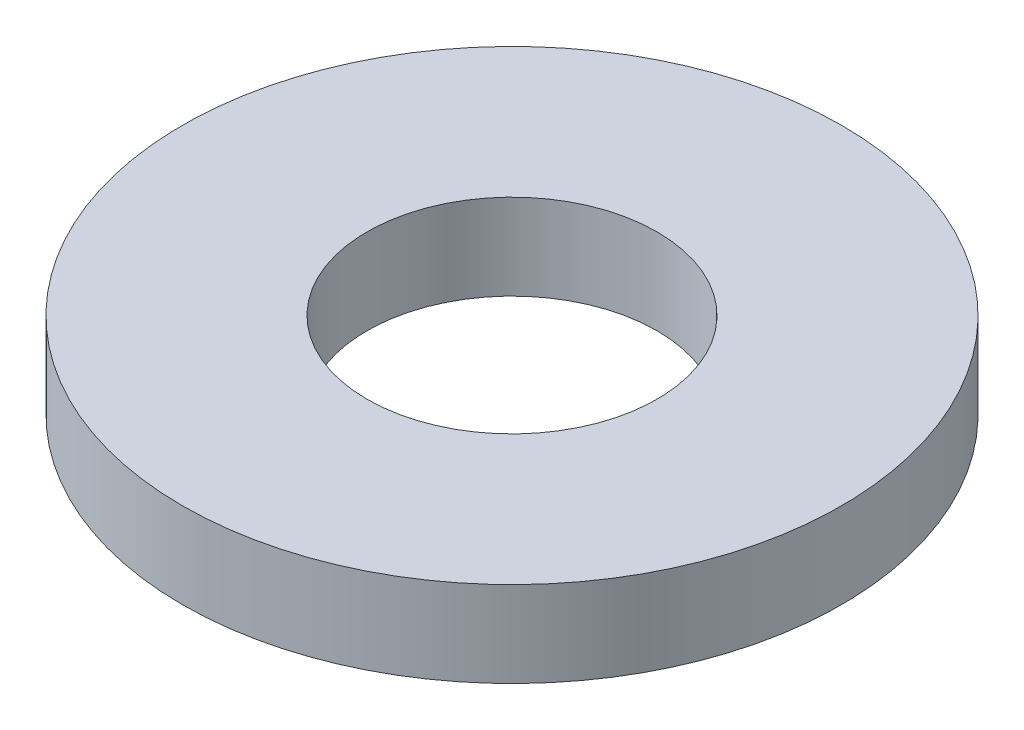
ISO-10303-21;
HEADER;
FILE_DESCRIPTION(('STEP AP214'),'2;1');
FILE_NAME('part.step','',(''),(''),'','','');
FILE_SCHEMA(('AUTOMOTIVE_DESIGN { 1 0 10303 214 1 1 1 1 }'));
ENDSEC;
DATA;
#1=APPLICATION_CONTEXT('core data for automotive mechanical design processes');
#2=APPLICATION_PROTOCOL_DEFINITION('international standard','automotive_design',2000,#1);
#3=PRODUCT_CONTEXT('',#1,'mechanical');
#4=PRODUCT('Part','Part','',(#3));
#5=PRODUCT_RELATED_PRODUCT_CATEGORY('part','',(#4));
#6=PRODUCT_DEFINITION_FORMATION('','',#4);
#7=PRODUCT_DEFINITION_CONTEXT('part definition',#1,'design');
#8=PRODUCT_DEFINITION('design','',#6,#7);
#9=PRODUCT_DEFINITION_SHAPE('','',#8);
#10=(LENGTH_UNIT() NAMED_UNIT(*) SI_UNIT(.MILLI.,.METRE.));
#11=(NAMED_UNIT(*) PLANE_ANGLE_UNIT() SI_UNIT($,.RADIAN.));
#12=(NAMED_UNIT(*) SI_UNIT($,.STERADIAN.) SOLID_ANGLE_UNIT());
#13=UNCERTAINTY_MEASURE_WITH_UNIT(LENGTH_MEASURE(1.E-05),#10,'distance_accuracy_value','');
#14=(GEOMETRIC_REPRESENTATION_CONTEXT(3) GLOBAL_UNCERTAINTY_ASSIGNED_CONTEXT((#13)) GLOBAL_UNIT_ASSIGNED_CONTEXT((#10,
#11,#12)) REPRESENTATION_CONTEXT('',''));
#15=CARTESIAN_POINT('',(0.,0.,0.));
#16=DIRECTION('',(0.,0.,1.));
#17=DIRECTION('',(1.,0.,0.));
#18=AXIS2_PLACEMENT_3D('',#15,#16,#17);
#19=CARTESIAN_POINT('',(0.,1.651,0.));
#20=DIRECTION('',(0.,-1.,0.));
#21=DIRECTION('',(0.,0.,-1.));
#22=AXIS2_PLACEMENT_3D('',#19,#20,#21);
#23=CYLINDRICAL_SURFACE('',#22,6.35);
#24=CARTESIAN_POINT('',(0.,1.651,0.));
#25=DIRECTION('',(0.,1.,0.));
#26=DIRECTION('',(0.,0.,1.));
#27=AXIS2_PLACEMENT_3D('',#24,#25,#26);
#28=CIRCLE('',#27,6.35);
#29=CARTESIAN_POINT('',(0.,1.651,-6.35));
#30=VERTEX_POINT('',#29);
#31=EDGE_CURVE('E10',#30,#30,#28,.T.);
#32=CARTESIAN_POINT('',(0.,0.,0.));
#33=DIRECTION('',(0.,1.,0.));
#34=DIRECTION('',(0.,0.,1.));
#35=AXIS2_PLACEMENT_3D('',#32,#33,#34);
#36=CIRCLE('',#35,6.35);
#37=CARTESIAN_POINT('',(0.,0.,-6.35));
#38=VERTEX_POINT('',#37);
#39=EDGE_CURVE('E33',#38,#38,#36,.T.);
#40=CARTESIAN_POINT('',(0.,1.651,-6.35));
#41=CARTESIAN_POINT('',(0.,1.63380208333333,-6.35));
#42=CARTESIAN_POINT('',(0.,1.61660416666667,-6.35));
#43=CARTESIAN_POINT('',(0.,1.58220833333333,-6.35));
#44=CARTESIAN_POINT('',(0.,1.56501041666667,-6.35));
#45=CARTESIAN_POINT('',(0.,1.53061458333333,-6.35));
#46=CARTESIAN_POINT('',(0.,1.51341666666667,-6.35));
#47=CARTESIAN_POINT('',(0.,1.47902083333333,-6.35));
#48=CARTESIAN_POINT('',(0.,1.46182291666667,-6.35));
#49=CARTESIAN_POINT('',(0.,1.42742708333333,-6.35));
#50=CARTESIAN_POINT('',(0.,1.41022916666667,-6.35));
#51=CARTESIAN_POINT('',(0.,1.37583333333333,-6.35));
#52=CARTESIAN_POINT('',(0.,1.35863541666667,-6.35));
#53=CARTESIAN_POINT('',(0.,1.32423958333333,-6.35));
#54=CARTESIAN_POINT('',(0.,1.30704166666667,-6.35));
#55=CARTESIAN_POINT('',(0.,1.27264583333333,-6.35));
#56=CARTESIAN_POINT('',(0.,1.25544791666667,-6.35));
#57=CARTESIAN_POINT('',(0.,1.22105208333333,-6.35));
#58=CARTESIAN_POINT('',(0.,1.20385416666667,-6.35));
#59=CARTESIAN_POINT('',(0.,1.16945833333333,-6.35));
#60=CARTESIAN_POINT('',(0.,1.15226041666667,-6.35));
#61=CARTESIAN_POINT('',(0.,1.11786458333333,-6.35));
#62=CARTESIAN_POINT('',(0.,1.10066666666667,-6.35));
#63=CARTESIAN_POINT('',(0.,1.06627083333333,-6.35));
#64=CARTESIAN_POINT('',(0.,1.04907291666667,-6.35));
#65=CARTESIAN_POINT('',(0.,1.01467708333333,-6.35));
#66=CARTESIAN_POINT('',(0.,0.997479166666666,-6.35));
#67=CARTESIAN_POINT('',(0.,0.963083333333333,-6.35));
#68=CARTESIAN_POINT('',(0.,0.945885416666667,-6.35));
#69=CARTESIAN_POINT('',(0.,0.911489583333333,-6.35));
#70=CARTESIAN_POINT('',(0.,0.894291666666667,-6.35));
#71=CARTESIAN_POINT('',(0.,0.859895833333333,-6.35));
#72=CARTESIAN_POINT('',(0.,0.842697916666667,-6.35));
#73=CARTESIAN_POINT('',(0.,0.808302083333333,-6.35));
#74=CARTESIAN_POINT('',(0.,0.791104166666667,-6.35));
#75=CARTESIAN_POINT('',(0.,0.756708333333333,-6.35));
#76=CARTESIAN_POINT('',(0.,0.739510416666667,-6.35));
#77=CARTESIAN_POINT('',(0.,0.705114583333333,-6.35));
#78=CARTESIAN_POINT('',(0.,0.687916666666667,-6.35));
#79=CARTESIAN_POINT('',(0.,0.653520833333333,-6.35));
#80=CARTESIAN_POINT('',(0.,0.636322916666667,-6.35));
#81=CARTESIAN_POINT('',(0.,0.601927083333333,-6.35));
#82=CARTESIAN_POINT('',(0.,0.584729166666667,-6.35));
#83=CARTESIAN_POINT('',(0.,0.550333333333333,-6.35));
#84=CARTESIAN_POINT('',(0.,0.533135416666667,-6.35));
#85=CARTESIAN_POINT('',(0.,0.498739583333333,-6.35));
#86=CARTESIAN_POINT('',(0.,0.481541666666667,-6.35));
#87=CARTESIAN_POINT('',(0.,0.447145833333333,-6.35));
#88=CARTESIAN_POINT('',(0.,0.429947916666667,-6.35));
#89=CARTESIAN_POINT('',(0.,0.395552083333333,-6.35));
#90=CARTESIAN_POINT('',(0.,0.378354166666667,-6.35));
#91=CARTESIAN_POINT('',(0.,0.343958333333333,-6.35));
#92=CARTESIAN_POINT('',(0.,0.326760416666667,-6.35));
#93=CARTESIAN_POINT('',(0.,0.292364583333333,-6.35));
#94=CARTESIAN_POINT('',(0.,0.275166666666667,-6.35));
#95=CARTESIAN_POINT('',(0.,0.240770833333333,-6.35));
#96=CARTESIAN_POINT('',(0.,0.223572916666667,-6.35));
#97=CARTESIAN_POINT('',(0.,0.189177083333333,-6.35));
#98=CARTESIAN_POINT('',(0.,0.171979166666667,-6.35));
#99=CARTESIAN_POINT('',(0.,0.137583333333333,-6.35));
#100=CARTESIAN_POINT('',(0.,0.120385416666667,-6.35));
#101=CARTESIAN_POINT('',(0.,0.0859895833333333,-6.35));
#102=CARTESIAN_POINT('',(0.,0.0687916666666667,-6.35));
#103=CARTESIAN_POINT('',(0.,0.0343958333333333,-6.35));
#104=CARTESIAN_POINT('',(0.,0.0171979166666666,-6.35));
#105=CARTESIAN_POINT('',(0.,0.,-6.35));
#106=B_SPLINE_CURVE_WITH_KNOTS('',3,(#40,#41,#42,#43,#44,#45,#46,#47,#48,#49,#50,#51,#52,#53,
#54,#55,#56,#57,#58,#59,#60,#61,#62,#63,#64,#65,#66,#67,#68,#69,#70,#71,#72,#73,#74,#75,#76,#77,
#78,#79,#80,#81,#82,#83,#84,#85,#86,#87,#88,#89,#90,#91,#92,#93,#94,#95,#96,#97,#98,#99,#100,
#101,#102,#103,#104,#105),.UNSPECIFIED.,.F.,.F.,(4,2,2,2,2,2,2,2,2,2,2,2,2,2,2,2,2,2,2,2,2,2,2,
2,2,2,2,2,2,2,2,2,4),(0.,0.05159375,0.1031875,0.15478125,0.206375,0.25796875,0.3095625,
0.36115625,0.41275,0.46434375,0.5159375,0.56753125,0.619125,0.67071875,0.7223125,0.77390625,
0.8255,0.87709375,0.9286875,0.98028125,1.031875,1.08346875,1.1350625,1.18665625,1.23825,
1.28984375,1.3414375,1.39303125,1.444625,1.49621875,1.5478125,1.59940625,1.651),.UNSPECIFIED.);
#107=EDGE_CURVE('BSEAM30',#30,#38,#106,.T.);
#108=ORIENTED_EDGE('',*,*,#31,.F.);
#109=ORIENTED_EDGE('',*,*,#39,.T.);
#110=ORIENTED_EDGE('',*,*,#107,.T.);
#111=ORIENTED_EDGE('',*,*,#107,.F.);
#112=EDGE_LOOP('',(#108,#110,#109,#111));
#113=FACE_BOUND('',#112,.T.);
#114=ADVANCED_FACE('F30',(#113),#23,.T.);
#115=CARTESIAN_POINT('',(0.,1.651,0.));
#116=DIRECTION('',(0.,1.,0.));
#117=DIRECTION('',(0.,0.,1.));
#118=AXIS2_PLACEMENT_3D('',#115,#116,#117);
#119=PLANE('',#118);
#120=CARTESIAN_POINT('',(0.,1.651,0.));
#121=DIRECTION('',(0.,1.,0.));
#122=DIRECTION('',(0.,0.,1.));
#123=AXIS2_PLACEMENT_3D('',#120,#121,#122);
#124=CIRCLE('',#123,2.794);
#125=CARTESIAN_POINT('',(0.,1.651,2.794));
#126=VERTEX_POINT('',#125);
#127=EDGE_CURVE('E42',#126,#126,#124,.T.);
#128=ORIENTED_EDGE('',*,*,#127,.F.);
#129=EDGE_LOOP('',(#128));
#130=FACE_BOUND('',#129,.T.);
#131=ORIENTED_EDGE('',*,*,#31,.T.);
#132=EDGE_LOOP('',(#131));
#133=FACE_BOUND('',#132,.T.);
#134=ADVANCED_FACE('F57',(#130,#133),#119,.T.);
#135=CARTESIAN_POINT('',(0.,0.,0.));
#136=DIRECTION('',(0.,1.,0.));
#137=DIRECTION('',(0.,0.,1.));
#138=AXIS2_PLACEMENT_3D('',#135,#136,#137);
#139=PLANE('',#138);
#140=CARTESIAN_POINT('',(0.,0.,0.));
#141=DIRECTION('',(0.,1.,0.));
#142=DIRECTION('',(0.,0.,1.));
#143=AXIS2_PLACEMENT_3D('',#140,#141,#142);
#144=CIRCLE('',#143,2.794);
#145=CARTESIAN_POINT('',(0.,0.,2.794));
#146=VERTEX_POINT('',#145);
#147=EDGE_CURVE('E40',#146,#146,#144,.T.);
#148=ORIENTED_EDGE('',*,*,#147,.T.);
#149=EDGE_LOOP('',(#148));
#150=FACE_BOUND('',#149,.T.);
#151=ORIENTED_EDGE('',*,*,#39,.F.);
#152=EDGE_LOOP('',(#151));
#153=FACE_BOUND('',#152,.T.);
#154=ADVANCED_FACE('F48',(#150,#153),#139,.F.);
#155=CARTESIAN_POINT('',(0.,0.,0.));
#156=DIRECTION('',(0.,1.,0.));
#157=DIRECTION('',(0.,0.,1.));
#158=AXIS2_PLACEMENT_3D('',#155,#156,#157);
#159=CYLINDRICAL_SURFACE('',#158,2.794);
#160=CARTESIAN_POINT('',(0.,0.,2.794));
#161=CARTESIAN_POINT('',(0.,0.0171979166666667,2.794));
#162=CARTESIAN_POINT('',(0.,0.0343958333333333,2.794));
#163=CARTESIAN_POINT('',(0.,0.0687916666666667,2.794));
#164=CARTESIAN_POINT('',(0.,0.0859895833333333,2.794));
#165=CARTESIAN_POINT('',(0.,0.120385416666667,2.794));
#166=CARTESIAN_POINT('',(0.,0.137583333333333,2.794));
#167=CARTESIAN_POINT('',(0.,0.171979166666667,2.794));
#168=CARTESIAN_POINT('',(0.,0.189177083333333,2.794));
#169=CARTESIAN_POINT('',(0.,0.223572916666667,2.794));
#170=CARTESIAN_POINT('',(0.,0.240770833333333,2.794));
#171=CARTESIAN_POINT('',(0.,0.275166666666667,2.794));
#172=CARTESIAN_POINT('',(0.,0.292364583333333,2.794));
#173=CARTESIAN_POINT('',(0.,0.326760416666667,2.794));
#174=CARTESIAN_POINT('',(0.,0.343958333333333,2.794));
#175=CARTESIAN_POINT('',(0.,0.378354166666667,2.794));
#176=CARTESIAN_POINT('',(0.,0.395552083333333,2.794));
#177=CARTESIAN_POINT('',(0.,0.429947916666667,2.794));
#178=CARTESIAN_POINT('',(0.,0.447145833333333,2.794));
#179=CARTESIAN_POINT('',(0.,0.481541666666667,2.794));
#180=CARTESIAN_POINT('',(0.,0.498739583333333,2.794));
#181=CARTESIAN_POINT('',(0.,0.533135416666667,2.794));
#182=CARTESIAN_POINT('',(0.,0.550333333333333,2.794));
#183=CARTESIAN_POINT('',(0.,0.584729166666667,2.794));
#184=CARTESIAN_POINT('',(0.,0.601927083333333,2.794));
#185=CARTESIAN_POINT('',(0.,0.636322916666667,2.794));
#186=CARTESIAN_POINT('',(0.,0.653520833333333,2.794));
#187=CARTESIAN_POINT('',(0.,0.687916666666667,2.794));
#188=CARTESIAN_POINT('',(0.,0.705114583333333,2.794));
#189=CARTESIAN_POINT('',(0.,0.739510416666667,2.794));
#190=CARTESIAN_POINT('',(0.,0.756708333333333,2.794));
#191=CARTESIAN_POINT('',(0.,0.791104166666667,2.794));
#192=CARTESIAN_POINT('',(0.,0.808302083333333,2.794));
#193=CARTESIAN_POINT('',(0.,0.842697916666667,2.794));
#194=CARTESIAN_POINT('',(0.,0.859895833333333,2.794));
#195=CARTESIAN_POINT('',(0.,0.894291666666667,2.794));
#196=CARTESIAN_POINT('',(0.,0.911489583333333,2.794));
#197=CARTESIAN_POINT('',(0.,0.945885416666667,2.794));
#198=CARTESIAN_POINT('',(0.,0.963083333333333,2.794));
#199=CARTESIAN_POINT('',(0.,0.997479166666666,2.794));
#200=CARTESIAN_POINT('',(0.,1.01467708333333,2.794));
#201=CARTESIAN_POINT('',(0.,1.04907291666667,2.794));
#202=CARTESIAN_POINT('',(0.,1.06627083333333,2.794));
#203=CARTESIAN_POINT('',(0.,1.10066666666667,2.794));
#204=CARTESIAN_POINT('',(0.,1.11786458333333,2.794));
#205=CARTESIAN_POINT('',(0.,1.15226041666667,2.794));
#206=CARTESIAN_POINT('',(0.,1.16945833333333,2.794));
#207=CARTESIAN_POINT('',(0.,1.20385416666667,2.794));
#208=CARTESIAN_POINT('',(0.,1.22105208333333,2.794));
#209=CARTESIAN_POINT('',(0.,1.25544791666667,2.794));
#210=CARTESIAN_POINT('',(0.,1.27264583333333,2.794));
#211=CARTESIAN_POINT('',(0.,1.30704166666667,2.794));
#212=CARTESIAN_POINT('',(0.,1.32423958333333,2.794));
#213=CARTESIAN_POINT('',(0.,1.35863541666667,2.794));
#214=CARTESIAN_POINT('',(0.,1.37583333333333,2.794));
#215=CARTESIAN_POINT('',(0.,1.41022916666667,2.794));
#216=CARTESIAN_POINT('',(0.,1.42742708333333,2.794));
#217=CARTESIAN_POINT('',(0.,1.46182291666667,2.794));
#218=CARTESIAN_POINT('',(0.,1.47902083333333,2.794));
#219=CARTESIAN_POINT('',(0.,1.51341666666667,2.794));
#220=CARTESIAN_POINT('',(0.,1.53061458333333,2.794));
#221=CARTESIAN_POINT('',(0.,1.56501041666667,2.794));
#222=CARTESIAN_POINT('',(0.,1.58220833333333,2.794));
#223=CARTESIAN_POINT('',(0.,1.61660416666667,2.794));
#224=CARTESIAN_POINT('',(0.,1.63380208333333,2.794));
#225=CARTESIAN_POINT('',(0.,1.651,2.794));
#226=B_SPLINE_CURVE_WITH_KNOTS('',3,(#160,#161,#162,#163,#164,#165,#166,#167,#168,#169,#170,
#171,#172,#173,#174,#175,#176,#177,#178,#179,#180,#181,#182,#183,#184,#185,#186,#187,#188,#189,
#190,#191,#192,#193,#194,#195,#196,#197,#198,#199,#200,#201,#202,#203,#204,#205,#206,#207,#208,
#209,#210,#211,#212,#213,#214,#215,#216,#217,#218,#219,#220,#221,#222,#223,#224,#225),
.UNSPECIFIED.,.F.,.F.,(4,2,2,2,2,2,2,2,2,2,2,2,2,2,2,2,2,2,2,2,2,2,2,2,2,2,2,2,2,2,2,2,4),(0.,
0.05159375,0.1031875,0.15478125,0.206375,0.25796875,0.3095625,0.36115625,0.41275,0.46434375,
0.5159375,0.56753125,0.619125,0.67071875,0.7223125,0.77390625,0.8255,0.87709375,0.9286875,
0.98028125,1.031875,1.08346875,1.1350625,1.18665625,1.23825,1.28984375,1.3414375,1.39303125,
1.444625,1.49621875,1.5478125,1.59940625,1.651),.UNSPECIFIED.);
#227=EDGE_CURVE('BSEAM51',#146,#126,#226,.T.);
#228=ORIENTED_EDGE('',*,*,#147,.F.);
#229=ORIENTED_EDGE('',*,*,#127,.T.);
#230=ORIENTED_EDGE('',*,*,#227,.T.);
#231=ORIENTED_EDGE('',*,*,#227,.F.);
#232=EDGE_LOOP('',(#228,#230,#229,#231));
#233=FACE_BOUND('',#232,.T.);
#234=ADVANCED_FACE('F51',(#233),#159,.F.);
#235=CLOSED_SHELL('',(#114,#134,#154,#234));
#236=MANIFOLD_SOLID_BREP('B2',#235);
#237=ADVANCED_BREP_SHAPE_REPRESENTATION('',(#18,#236),#14);
#238=SHAPE_DEFINITION_REPRESENTATION(#9,#237);
ENDSEC;
END-ISO-10303-21;
